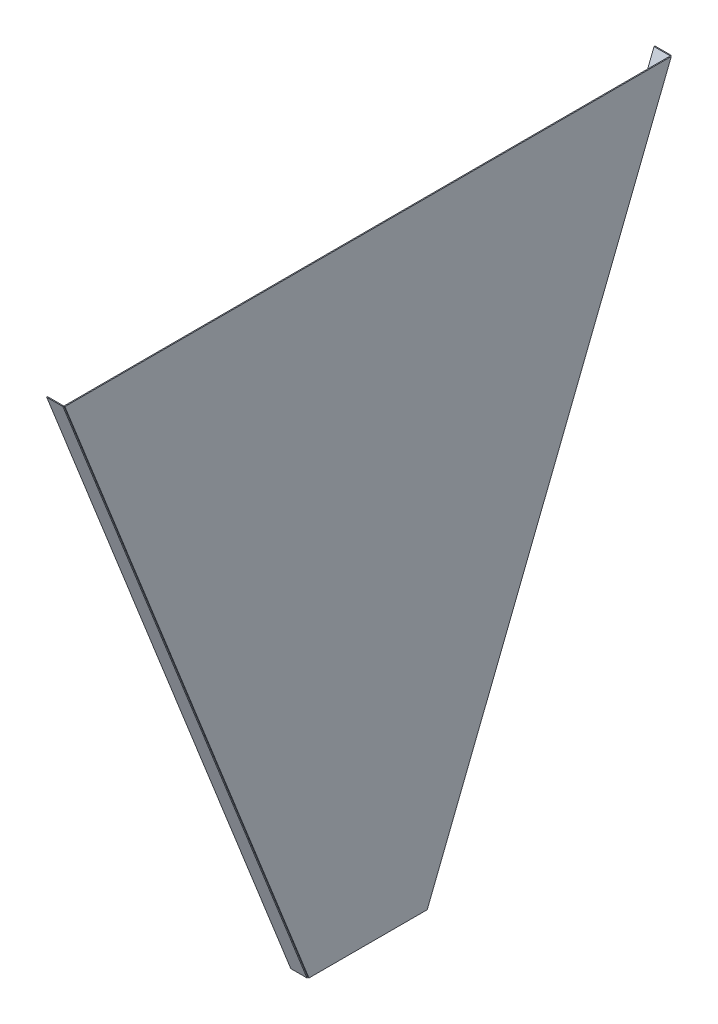
ISO-10303-21;
HEADER;
FILE_DESCRIPTION(('STEP AP214'),'2;1');
FILE_NAME('part.step','',(''),(''),'','','');
FILE_SCHEMA(('AUTOMOTIVE_DESIGN { 1 0 10303 214 1 1 1 1 }'));
ENDSEC;
DATA;
#1=APPLICATION_CONTEXT('core data for automotive mechanical design processes');
#2=APPLICATION_PROTOCOL_DEFINITION('international standard','automotive_design',2000,#1);
#3=PRODUCT_CONTEXT('',#1,'mechanical');
#4=PRODUCT('Part','Part','',(#3));
#5=PRODUCT_RELATED_PRODUCT_CATEGORY('part','',(#4));
#6=PRODUCT_DEFINITION_FORMATION('','',#4);
#7=PRODUCT_DEFINITION_CONTEXT('part definition',#1,'design');
#8=PRODUCT_DEFINITION('design','',#6,#7);
#9=PRODUCT_DEFINITION_SHAPE('','',#8);
#10=(LENGTH_UNIT() NAMED_UNIT(*) SI_UNIT(.MILLI.,.METRE.));
#11=(NAMED_UNIT(*) PLANE_ANGLE_UNIT() SI_UNIT($,.RADIAN.));
#12=(NAMED_UNIT(*) SI_UNIT($,.STERADIAN.) SOLID_ANGLE_UNIT());
#13=UNCERTAINTY_MEASURE_WITH_UNIT(LENGTH_MEASURE(1.E-05),#10,'distance_accuracy_value','');
#14=(GEOMETRIC_REPRESENTATION_CONTEXT(3) GLOBAL_UNCERTAINTY_ASSIGNED_CONTEXT((#13)) GLOBAL_UNIT_ASSIGNED_CONTEXT((#10,
#11,#12)) REPRESENTATION_CONTEXT('',''));
#15=CARTESIAN_POINT('',(0.,0.,0.));
#16=DIRECTION('',(0.,0.,1.));
#17=DIRECTION('',(1.,0.,0.));
#18=AXIS2_PLACEMENT_3D('',#15,#16,#17);
#19=CARTESIAN_POINT('',(-20.,381.,-375.7));
#20=DIRECTION('',(0.,1.,0.));
#21=DIRECTION('',(0.,0.,1.));
#22=AXIS2_PLACEMENT_3D('',#19,#20,#21);
#23=PLANE('',#22);
#24=DIRECTION('',(0.,0.,1.));
#25=VECTOR('',#24,1.);
#26=CARTESIAN_POINT('',(0.,381.,-375.7));
#27=LINE('',#26,#25);
#28=CARTESIAN_POINT('',(0.,381.,-375.7));
#29=VERTEX_POINT('',#28);
#30=CARTESIAN_POINT('',(0.,381.,-374.5));
#31=VERTEX_POINT('',#30);
#32=EDGE_CURVE('E12',#29,#31,#27,.T.);
#33=ORIENTED_EDGE('',*,*,#32,.F.);
#34=DIRECTION('',(1.,0.,0.));
#35=VECTOR('',#34,1.);
#36=CARTESIAN_POINT('',(-20.,381.,-375.7));
#37=LINE('',#36,#35);
#38=CARTESIAN_POINT('',(-20.,381.,-375.7));
#39=VERTEX_POINT('',#38);
#40=EDGE_CURVE('E97',#39,#29,#37,.T.);
#41=ORIENTED_EDGE('',*,*,#40,.F.);
#42=DIRECTION('',(0.,0.,1.));
#43=VECTOR('',#42,1.);
#44=CARTESIAN_POINT('',(-20.,381.,-375.7));
#45=LINE('',#44,#43);
#46=CARTESIAN_POINT('',(-20.,381.,-374.5));
#47=VERTEX_POINT('',#46);
#48=EDGE_CURVE('E54',#39,#47,#45,.T.);
#49=ORIENTED_EDGE('',*,*,#48,.T.);
#50=DIRECTION('',(1.,0.,0.));
#51=VECTOR('',#50,1.);
#52=CARTESIAN_POINT('',(-20.,381.,-374.5));
#53=LINE('',#52,#51);
#54=EDGE_CURVE('E69',#47,#31,#53,.T.);
#55=ORIENTED_EDGE('',*,*,#54,.T.);
#56=EDGE_LOOP('',(#33,#41,#49,#55));
#57=FACE_BOUND('',#56,.T.);
#58=ADVANCED_FACE('F50',(#57),#23,.T.);
#59=CARTESIAN_POINT('',(-20.,-381.,-74.1999999999999));
#60=DIRECTION('',(0.,-0.36791657387322,-0.929858803619878));
#61=DIRECTION('',(0.,0.929858803619878,-0.36791657387322));
#62=AXIS2_PLACEMENT_3D('',#59,#60,#61);
#63=PLANE('',#62);
#64=DIRECTION('',(0.,0.929858803619878,-0.36791657387322));
#65=VECTOR('',#64,1.);
#66=CARTESIAN_POINT('',(0.,-381.,-74.1999999999999));
#67=LINE('',#66,#65);
#68=CARTESIAN_POINT('',(0.,-381.,-74.1999999999999));
#69=VERTEX_POINT('',#68);
#70=EDGE_CURVE('E110',#69,#29,#67,.T.);
#71=ORIENTED_EDGE('',*,*,#70,.F.);
#72=DIRECTION('',(1.,0.,0.));
#73=VECTOR('',#72,1.);
#74=CARTESIAN_POINT('',(-20.,-381.,-74.1999999999999));
#75=LINE('',#74,#73);
#76=CARTESIAN_POINT('',(-20.,-381.,-74.1999999999999));
#77=VERTEX_POINT('',#76);
#78=EDGE_CURVE('E99',#77,#69,#75,.T.);
#79=ORIENTED_EDGE('',*,*,#78,.F.);
#80=DIRECTION('',(0.,0.929858803619878,-0.36791657387322));
#81=VECTOR('',#80,1.);
#82=CARTESIAN_POINT('',(-20.,-381.,-74.1999999999999));
#83=LINE('',#82,#81);
#84=EDGE_CURVE('E118',#77,#39,#83,.T.);
#85=ORIENTED_EDGE('',*,*,#84,.T.);
#86=ORIENTED_EDGE('',*,*,#40,.T.);
#87=EDGE_LOOP('',(#71,#79,#85,#86));
#88=FACE_BOUND('',#87,.T.);
#89=ADVANCED_FACE('F112',(#88),#63,.T.);
#90=CARTESIAN_POINT('',(-20.,-381.,-73.));
#91=DIRECTION('',(0.,-1.,0.));
#92=DIRECTION('',(0.,0.,-1.));
#93=AXIS2_PLACEMENT_3D('',#90,#91,#92);
#94=PLANE('',#93);
#95=DIRECTION('',(0.,0.,-1.));
#96=VECTOR('',#95,1.);
#97=CARTESIAN_POINT('',(0.,-381.,-73.));
#98=LINE('',#97,#96);
#99=CARTESIAN_POINT('',(0.,-381.,-73.));
#100=VERTEX_POINT('',#99);
#101=EDGE_CURVE('E102',#100,#69,#98,.T.);
#102=ORIENTED_EDGE('',*,*,#101,.F.);
#103=DIRECTION('',(1.,0.,0.));
#104=VECTOR('',#103,1.);
#105=CARTESIAN_POINT('',(-20.,-381.,-73.));
#106=LINE('',#105,#104);
#107=CARTESIAN_POINT('',(-20.,-381.,-73.));
#108=VERTEX_POINT('',#107);
#109=EDGE_CURVE('E86',#108,#100,#106,.T.);
#110=ORIENTED_EDGE('',*,*,#109,.F.);
#111=DIRECTION('',(0.,0.,-1.));
#112=VECTOR('',#111,1.);
#113=CARTESIAN_POINT('',(-20.,-381.,-73.));
#114=LINE('',#113,#112);
#115=EDGE_CURVE('E104',#108,#77,#114,.T.);
#116=ORIENTED_EDGE('',*,*,#115,.T.);
#117=ORIENTED_EDGE('',*,*,#78,.T.);
#118=EDGE_LOOP('',(#102,#110,#116,#117));
#119=FACE_BOUND('',#118,.T.);
#120=ADVANCED_FACE('F101',(#119),#94,.T.);
#121=CARTESIAN_POINT('',(-20.,381.,-374.5));
#122=DIRECTION('',(0.,0.36791657387322,0.929858803619878));
#123=DIRECTION('',(0.,-0.929858803619878,0.36791657387322));
#124=AXIS2_PLACEMENT_3D('',#121,#122,#123);
#125=PLANE('',#124);
#126=DIRECTION('',(0.,-0.929858803619878,0.36791657387322));
#127=VECTOR('',#126,1.);
#128=CARTESIAN_POINT('',(0.,381.,-374.5));
#129=LINE('',#128,#127);
#130=EDGE_CURVE('E60',#31,#100,#129,.T.);
#131=ORIENTED_EDGE('',*,*,#130,.F.);
#132=ORIENTED_EDGE('',*,*,#54,.F.);
#133=DIRECTION('',(0.,-0.929858803619878,0.36791657387322));
#134=VECTOR('',#133,1.);
#135=CARTESIAN_POINT('',(-20.,381.,-374.5));
#136=LINE('',#135,#134);
#137=EDGE_CURVE('E114',#47,#108,#136,.T.);
#138=ORIENTED_EDGE('',*,*,#137,.T.);
#139=ORIENTED_EDGE('',*,*,#109,.T.);
#140=EDGE_LOOP('',(#131,#132,#138,#139));
#141=FACE_BOUND('',#140,.T.);
#142=ADVANCED_FACE('F120',(#141),#125,.T.);
#143=CARTESIAN_POINT('',(-20.,0.,0.));
#144=DIRECTION('',(1.,0.,0.));
#145=DIRECTION('',(0.,0.,-1.));
#146=AXIS2_PLACEMENT_3D('',#143,#144,#145);
#147=PLANE('',#146);
#148=ORIENTED_EDGE('',*,*,#48,.F.);
#149=ORIENTED_EDGE('',*,*,#84,.F.);
#150=ORIENTED_EDGE('',*,*,#115,.F.);
#151=ORIENTED_EDGE('',*,*,#137,.F.);
#152=EDGE_LOOP('',(#148,#149,#150,#151));
#153=FACE_BOUND('',#152,.T.);
#154=ADVANCED_FACE('F52',(#153),#147,.F.);
#155=CARTESIAN_POINT('',(0.,0.,0.));
#156=DIRECTION('',(1.,0.,0.));
#157=DIRECTION('',(0.,0.,-1.));
#158=AXIS2_PLACEMENT_3D('',#155,#156,#157);
#159=PLANE('',#158);
#160=ORIENTED_EDGE('',*,*,#32,.T.);
#161=ORIENTED_EDGE('',*,*,#130,.T.);
#162=ORIENTED_EDGE('',*,*,#101,.T.);
#163=ORIENTED_EDGE('',*,*,#70,.T.);
#164=EDGE_LOOP('',(#160,#161,#162,#163));
#165=FACE_BOUND('',#164,.T.);
#166=ADVANCED_FACE('F109',(#165),#159,.T.);
#167=CLOSED_SHELL('',(#58,#89,#120,#142,#154,#166));
#168=MANIFOLD_SOLID_BREP('B2',#167);
#169=CARTESIAN_POINT('',(-20.,-381.,73.));
#170=DIRECTION('',(0.,1.,0.));
#171=DIRECTION('',(0.,0.,1.));
#172=AXIS2_PLACEMENT_3D('',#169,#170,#171);
#173=PLANE('',#172);
#174=DIRECTION('',(0.,0.,1.));
#175=VECTOR('',#174,1.);
#176=CARTESIAN_POINT('',(0.,-381.,73.));
#177=LINE('',#176,#175);
#178=CARTESIAN_POINT('',(0.,-381.,73.));
#179=VERTEX_POINT('',#178);
#180=CARTESIAN_POINT('',(0.,-381.,74.1999999999999));
#181=VERTEX_POINT('',#180);
#182=EDGE_CURVE('E246',#179,#181,#177,.T.);
#183=ORIENTED_EDGE('',*,*,#182,.T.);
#184=DIRECTION('',(1.,0.,0.));
#185=VECTOR('',#184,1.);
#186=CARTESIAN_POINT('',(-20.,-381.,74.1999999999999));
#187=LINE('',#186,#185);
#188=CARTESIAN_POINT('',(-20.,-381.,74.1999999999999));
#189=VERTEX_POINT('',#188);
#190=EDGE_CURVE('E48',#189,#181,#187,.T.);
#191=ORIENTED_EDGE('',*,*,#190,.F.);
#192=DIRECTION('',(0.,0.,1.));
#193=VECTOR('',#192,1.);
#194=CARTESIAN_POINT('',(-20.,-381.,73.));
#195=LINE('',#194,#193);
#196=CARTESIAN_POINT('',(-20.,-381.,73.));
#197=VERTEX_POINT('',#196);
#198=EDGE_CURVE('E234',#197,#189,#195,.T.);
#199=ORIENTED_EDGE('',*,*,#198,.F.);
#200=DIRECTION('',(1.,0.,0.));
#201=VECTOR('',#200,1.);
#202=CARTESIAN_POINT('',(-20.,-381.,73.));
#203=LINE('',#202,#201);
#204=EDGE_CURVE('E242',#197,#179,#203,.T.);
#205=ORIENTED_EDGE('',*,*,#204,.T.);
#206=EDGE_LOOP('',(#183,#191,#199,#205));
#207=FACE_BOUND('',#206,.T.);
#208=ADVANCED_FACE('F183',(#207),#173,.F.);
#209=CARTESIAN_POINT('',(-20.,-381.,74.1999999999999));
#210=DIRECTION('',(0.,0.36791657387322,-0.929858803619878));
#211=DIRECTION('',(0.,0.929858803619878,0.36791657387322));
#212=AXIS2_PLACEMENT_3D('',#209,#210,#211);
#213=PLANE('',#212);
#214=DIRECTION('',(0.,0.929858803619878,0.36791657387322));
#215=VECTOR('',#214,1.);
#216=CARTESIAN_POINT('',(0.,-381.,74.1999999999999));
#217=LINE('',#216,#215);
#218=CARTESIAN_POINT('',(0.,381.,375.7));
#219=VERTEX_POINT('',#218);
#220=EDGE_CURVE('E238',#181,#219,#217,.T.);
#221=ORIENTED_EDGE('',*,*,#220,.T.);
#222=DIRECTION('',(1.,0.,0.));
#223=VECTOR('',#222,1.);
#224=CARTESIAN_POINT('',(-20.,381.,375.7));
#225=LINE('',#224,#223);
#226=CARTESIAN_POINT('',(-20.,381.,375.7));
#227=VERTEX_POINT('',#226);
#228=EDGE_CURVE('E191',#227,#219,#225,.T.);
#229=ORIENTED_EDGE('',*,*,#228,.F.);
#230=DIRECTION('',(0.,0.929858803619878,0.36791657387322));
#231=VECTOR('',#230,1.);
#232=CARTESIAN_POINT('',(-20.,-381.,74.1999999999999));
#233=LINE('',#232,#231);
#234=EDGE_CURVE('E229',#189,#227,#233,.T.);
#235=ORIENTED_EDGE('',*,*,#234,.F.);
#236=ORIENTED_EDGE('',*,*,#190,.T.);
#237=EDGE_LOOP('',(#221,#229,#235,#236));
#238=FACE_BOUND('',#237,.T.);
#239=ADVANCED_FACE('F237',(#238),#213,.F.);
#240=CARTESIAN_POINT('',(-20.,381.,375.7));
#241=DIRECTION('',(0.,-1.,0.));
#242=DIRECTION('',(0.,0.,-1.));
#243=AXIS2_PLACEMENT_3D('',#240,#241,#242);
#244=PLANE('',#243);
#245=DIRECTION('',(0.,0.,-1.));
#246=VECTOR('',#245,1.);
#247=CARTESIAN_POINT('',(0.,381.,375.7));
#248=LINE('',#247,#246);
#249=CARTESIAN_POINT('',(0.,381.,374.5));
#250=VERTEX_POINT('',#249);
#251=EDGE_CURVE('E216',#219,#250,#248,.T.);
#252=ORIENTED_EDGE('',*,*,#251,.T.);
#253=DIRECTION('',(1.,0.,0.));
#254=VECTOR('',#253,1.);
#255=CARTESIAN_POINT('',(-20.,381.,374.5));
#256=LINE('',#255,#254);
#257=CARTESIAN_POINT('',(-20.,381.,374.5));
#258=VERTEX_POINT('',#257);
#259=EDGE_CURVE('E239',#258,#250,#256,.T.);
#260=ORIENTED_EDGE('',*,*,#259,.F.);
#261=DIRECTION('',(0.,0.,-1.));
#262=VECTOR('',#261,1.);
#263=CARTESIAN_POINT('',(-20.,381.,375.7));
#264=LINE('',#263,#262);
#265=EDGE_CURVE('E232',#227,#258,#264,.T.);
#266=ORIENTED_EDGE('',*,*,#265,.F.);
#267=ORIENTED_EDGE('',*,*,#228,.T.);
#268=EDGE_LOOP('',(#252,#260,#266,#267));
#269=FACE_BOUND('',#268,.T.);
#270=ADVANCED_FACE('F240',(#269),#244,.F.);
#271=CARTESIAN_POINT('',(-20.,381.,374.5));
#272=DIRECTION('',(0.,-0.36791657387322,0.929858803619878));
#273=DIRECTION('',(0.,-0.929858803619878,-0.36791657387322));
#274=AXIS2_PLACEMENT_3D('',#271,#272,#273);
#275=PLANE('',#274);
#276=DIRECTION('',(0.,-0.929858803619878,-0.36791657387322));
#277=VECTOR('',#276,1.);
#278=CARTESIAN_POINT('',(0.,381.,374.5));
#279=LINE('',#278,#277);
#280=EDGE_CURVE('E222',#250,#179,#279,.T.);
#281=ORIENTED_EDGE('',*,*,#280,.T.);
#282=ORIENTED_EDGE('',*,*,#204,.F.);
#283=DIRECTION('',(0.,-0.929858803619878,-0.36791657387322));
#284=VECTOR('',#283,1.);
#285=CARTESIAN_POINT('',(-20.,381.,374.5));
#286=LINE('',#285,#284);
#287=EDGE_CURVE('E199',#258,#197,#286,.T.);
#288=ORIENTED_EDGE('',*,*,#287,.F.);
#289=ORIENTED_EDGE('',*,*,#259,.T.);
#290=EDGE_LOOP('',(#281,#282,#288,#289));
#291=FACE_BOUND('',#290,.T.);
#292=ADVANCED_FACE('F253',(#291),#275,.F.);
#293=CARTESIAN_POINT('',(-20.,0.,0.));
#294=DIRECTION('',(-1.,0.,0.));
#295=DIRECTION('',(0.,0.,1.));
#296=AXIS2_PLACEMENT_3D('',#293,#294,#295);
#297=PLANE('',#296);
#298=ORIENTED_EDGE('',*,*,#198,.T.);
#299=ORIENTED_EDGE('',*,*,#234,.T.);
#300=ORIENTED_EDGE('',*,*,#265,.T.);
#301=ORIENTED_EDGE('',*,*,#287,.T.);
#302=EDGE_LOOP('',(#298,#299,#300,#301));
#303=FACE_BOUND('',#302,.T.);
#304=ADVANCED_FACE('F230',(#303),#297,.T.);
#305=CARTESIAN_POINT('',(0.,0.,0.));
#306=DIRECTION('',(-1.,0.,0.));
#307=DIRECTION('',(0.,0.,1.));
#308=AXIS2_PLACEMENT_3D('',#305,#306,#307);
#309=PLANE('',#308);
#310=ORIENTED_EDGE('',*,*,#182,.F.);
#311=ORIENTED_EDGE('',*,*,#280,.F.);
#312=ORIENTED_EDGE('',*,*,#251,.F.);
#313=ORIENTED_EDGE('',*,*,#220,.F.);
#314=EDGE_LOOP('',(#310,#311,#312,#313));
#315=FACE_BOUND('',#314,.T.);
#316=ADVANCED_FACE('F256',(#315),#309,.F.);
#317=CLOSED_SHELL('',(#208,#239,#270,#292,#304,#316));
#318=MANIFOLD_SOLID_BREP('B6',#317);
#319=CARTESIAN_POINT('',(1.22,381.,374.5));
#320=DIRECTION('',(0.,0.36791657387322,-0.929858803619878));
#321=DIRECTION('',(0.,0.929858803619879,0.36791657387322));
#322=AXIS2_PLACEMENT_3D('',#319,#320,#321);
#323=PLANE('',#322);
#324=DIRECTION('',(0.,-0.929858803619878,-0.36791657387322));
#325=VECTOR('',#324,1.);
#326=CARTESIAN_POINT('',(0.,381.,374.5));
#327=LINE('',#326,#325);
#328=CARTESIAN_POINT('',(0.,381.,374.5));
#329=VERTEX_POINT('',#328);
#330=CARTESIAN_POINT('',(0.,-381.,73.));
#331=VERTEX_POINT('',#330);
#332=EDGE_CURVE('E375',#329,#331,#327,.T.);
#333=ORIENTED_EDGE('',*,*,#332,.T.);
#334=DIRECTION('',(-1.,0.,0.));
#335=VECTOR('',#334,1.);
#336=CARTESIAN_POINT('',(1.22,-381.,73.));
#337=LINE('',#336,#335);
#338=CARTESIAN_POINT('',(1.22,-381.,73.));
#339=VERTEX_POINT('',#338);
#340=EDGE_CURVE('E181',#339,#331,#337,.T.);
#341=ORIENTED_EDGE('',*,*,#340,.F.);
#342=DIRECTION('',(0.,-0.929858803619878,-0.36791657387322));
#343=VECTOR('',#342,1.);
#344=CARTESIAN_POINT('',(1.22,381.,374.5));
#345=LINE('',#344,#343);
#346=CARTESIAN_POINT('',(1.22,381.,374.5));
#347=VERTEX_POINT('',#346);
#348=EDGE_CURVE('E359',#347,#339,#345,.T.);
#349=ORIENTED_EDGE('',*,*,#348,.F.);
#350=DIRECTION('',(-1.,0.,0.));
#351=VECTOR('',#350,1.);
#352=CARTESIAN_POINT('',(1.22,381.,374.5));
#353=LINE('',#352,#351);
#354=EDGE_CURVE('E371',#347,#329,#353,.T.);
#355=ORIENTED_EDGE('',*,*,#354,.T.);
#356=EDGE_LOOP('',(#333,#341,#349,#355));
#357=FACE_BOUND('',#356,.T.);
#358=ADVANCED_FACE('F307',(#357),#323,.F.);
#359=CARTESIAN_POINT('',(1.22,-381.,0.));
#360=DIRECTION('',(0.,1.,0.));
#361=DIRECTION('',(0.,0.,1.));
#362=AXIS2_PLACEMENT_3D('',#359,#360,#361);
#363=PLANE('',#362);
#364=DIRECTION('',(0.,0.,-1.));
#365=VECTOR('',#364,1.);
#366=CARTESIAN_POINT('',(0.,-381.,0.));
#367=LINE('',#366,#365);
#368=CARTESIAN_POINT('',(0.,-381.,-73.));
#369=VERTEX_POINT('',#368);
#370=EDGE_CURVE('E364',#331,#369,#367,.T.);
#371=ORIENTED_EDGE('',*,*,#370,.T.);
#372=DIRECTION('',(-1.,0.,0.));
#373=VECTOR('',#372,1.);
#374=CARTESIAN_POINT('',(1.22,-381.,-73.));
#375=LINE('',#374,#373);
#376=CARTESIAN_POINT('',(1.22,-381.,-73.));
#377=VERTEX_POINT('',#376);
#378=EDGE_CURVE('E316',#377,#369,#375,.T.);
#379=ORIENTED_EDGE('',*,*,#378,.F.);
#380=DIRECTION('',(0.,0.,-1.));
#381=VECTOR('',#380,1.);
#382=CARTESIAN_POINT('',(1.22,-381.,0.));
#383=LINE('',#382,#381);
#384=EDGE_CURVE('E354',#339,#377,#383,.T.);
#385=ORIENTED_EDGE('',*,*,#384,.F.);
#386=ORIENTED_EDGE('',*,*,#340,.T.);
#387=EDGE_LOOP('',(#371,#379,#385,#386));
#388=FACE_BOUND('',#387,.T.);
#389=ADVANCED_FACE('F363',(#388),#363,.F.);
#390=CARTESIAN_POINT('',(1.22,381.,-374.5));
#391=DIRECTION('',(0.,0.36791657387322,0.929858803619878));
#392=DIRECTION('',(0.,-0.929858803619879,0.36791657387322));
#393=AXIS2_PLACEMENT_3D('',#390,#391,#392);
#394=PLANE('',#393);
#395=DIRECTION('',(0.,0.929858803619878,-0.36791657387322));
#396=VECTOR('',#395,1.);
#397=CARTESIAN_POINT('',(0.,381.,-374.5));
#398=LINE('',#397,#396);
#399=CARTESIAN_POINT('',(0.,381.,-374.5));
#400=VERTEX_POINT('',#399);
#401=EDGE_CURVE('E341',#369,#400,#398,.T.);
#402=ORIENTED_EDGE('',*,*,#401,.T.);
#403=DIRECTION('',(-1.,0.,0.));
#404=VECTOR('',#403,1.);
#405=CARTESIAN_POINT('',(1.22,381.,-374.5));
#406=LINE('',#405,#404);
#407=CARTESIAN_POINT('',(1.22,381.,-374.5));
#408=VERTEX_POINT('',#407);
#409=EDGE_CURVE('E366',#408,#400,#406,.T.);
#410=ORIENTED_EDGE('',*,*,#409,.F.);
#411=DIRECTION('',(0.,0.929858803619878,-0.36791657387322));
#412=VECTOR('',#411,1.);
#413=CARTESIAN_POINT('',(1.22,381.,-374.5));
#414=LINE('',#413,#412);
#415=EDGE_CURVE('E357',#377,#408,#414,.T.);
#416=ORIENTED_EDGE('',*,*,#415,.F.);
#417=ORIENTED_EDGE('',*,*,#378,.T.);
#418=EDGE_LOOP('',(#402,#410,#416,#417));
#419=FACE_BOUND('',#418,.T.);
#420=ADVANCED_FACE('F367',(#419),#394,.F.);
#421=CARTESIAN_POINT('',(1.22,381.,374.5));
#422=DIRECTION('',(0.,-1.,0.));
#423=DIRECTION('',(0.,0.,-1.));
#424=AXIS2_PLACEMENT_3D('',#421,#422,#423);
#425=PLANE('',#424);
#426=DIRECTION('',(0.,0.,1.));
#427=VECTOR('',#426,1.);
#428=CARTESIAN_POINT('',(0.,381.,374.5));
#429=LINE('',#428,#427);
#430=EDGE_CURVE('E347',#400,#329,#429,.T.);
#431=ORIENTED_EDGE('',*,*,#430,.T.);
#432=ORIENTED_EDGE('',*,*,#354,.F.);
#433=DIRECTION('',(0.,0.,1.));
#434=VECTOR('',#433,1.);
#435=CARTESIAN_POINT('',(1.22,381.,374.5));
#436=LINE('',#435,#434);
#437=EDGE_CURVE('E324',#408,#347,#436,.T.);
#438=ORIENTED_EDGE('',*,*,#437,.F.);
#439=ORIENTED_EDGE('',*,*,#409,.T.);
#440=EDGE_LOOP('',(#431,#432,#438,#439));
#441=FACE_BOUND('',#440,.T.);
#442=ADVANCED_FACE('F388',(#441),#425,.F.);
#443=CARTESIAN_POINT('',(1.22,0.,0.));
#444=DIRECTION('',(-1.,0.,0.));
#445=DIRECTION('',(0.,0.,1.));
#446=AXIS2_PLACEMENT_3D('',#443,#444,#445);
#447=PLANE('',#446);
#448=ORIENTED_EDGE('',*,*,#348,.T.);
#449=ORIENTED_EDGE('',*,*,#384,.T.);
#450=ORIENTED_EDGE('',*,*,#415,.T.);
#451=ORIENTED_EDGE('',*,*,#437,.T.);
#452=EDGE_LOOP('',(#448,#449,#450,#451));
#453=FACE_BOUND('',#452,.T.);
#454=ADVANCED_FACE('F355',(#453),#447,.F.);
#455=CARTESIAN_POINT('',(0.,0.,0.));
#456=DIRECTION('',(-1.,0.,0.));
#457=DIRECTION('',(0.,0.,1.));
#458=AXIS2_PLACEMENT_3D('',#455,#456,#457);
#459=PLANE('',#458);
#460=ORIENTED_EDGE('',*,*,#332,.F.);
#461=ORIENTED_EDGE('',*,*,#430,.F.);
#462=ORIENTED_EDGE('',*,*,#401,.F.);
#463=ORIENTED_EDGE('',*,*,#370,.F.);
#464=EDGE_LOOP('',(#460,#461,#462,#463));
#465=FACE_BOUND('',#464,.T.);
#466=ADVANCED_FACE('F391',(#465),#459,.T.);
#467=CLOSED_SHELL('',(#358,#389,#420,#442,#454,#466));
#468=MANIFOLD_SOLID_BREP('B42',#467);
#469=ADVANCED_BREP_SHAPE_REPRESENTATION('',(#18,#168,#318,#468),#14);
#470=SHAPE_DEFINITION_REPRESENTATION(#9,#469);
ENDSEC;
END-ISO-10303-21;
